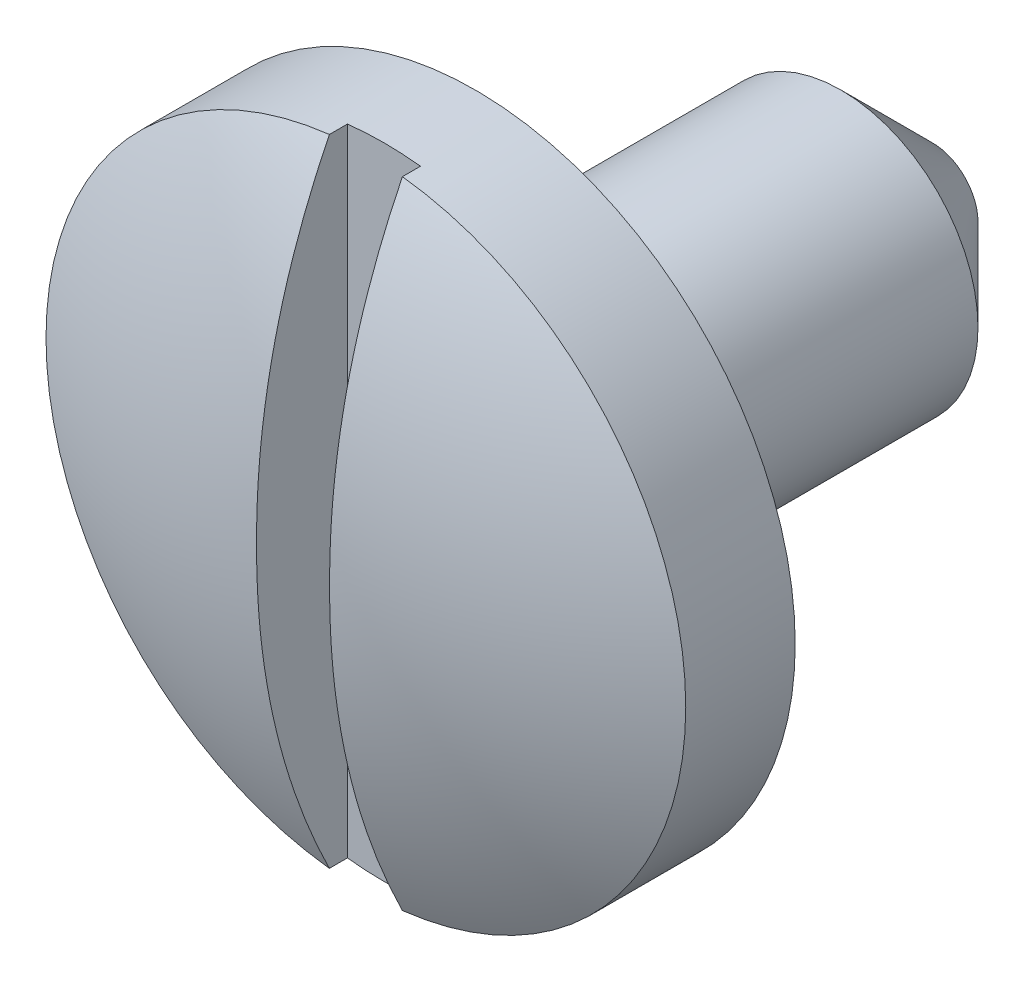
ISO-10303-21;
HEADER;
FILE_DESCRIPTION(('STEP AP214'),'2;1');
FILE_NAME('part.step','',(''),(''),'','','');
FILE_SCHEMA(('AUTOMOTIVE_DESIGN { 1 0 10303 214 1 1 1 1 }'));
ENDSEC;
DATA;
#1=APPLICATION_CONTEXT('core data for automotive mechanical design processes');
#2=APPLICATION_PROTOCOL_DEFINITION('international standard','automotive_design',2000,#1);
#3=PRODUCT_CONTEXT('',#1,'mechanical');
#4=PRODUCT('Part','Part','',(#3));
#5=PRODUCT_RELATED_PRODUCT_CATEGORY('part','',(#4));
#6=PRODUCT_DEFINITION_FORMATION('','',#4);
#7=PRODUCT_DEFINITION_CONTEXT('part definition',#1,'design');
#8=PRODUCT_DEFINITION('design','',#6,#7);
#9=PRODUCT_DEFINITION_SHAPE('','',#8);
#10=(LENGTH_UNIT() NAMED_UNIT(*) SI_UNIT(.MILLI.,.METRE.));
#11=(NAMED_UNIT(*) PLANE_ANGLE_UNIT() SI_UNIT($,.RADIAN.));
#12=(NAMED_UNIT(*) SI_UNIT($,.STERADIAN.) SOLID_ANGLE_UNIT());
#13=UNCERTAINTY_MEASURE_WITH_UNIT(LENGTH_MEASURE(1.E-05),#10,'distance_accuracy_value','');
#14=(GEOMETRIC_REPRESENTATION_CONTEXT(3) GLOBAL_UNCERTAINTY_ASSIGNED_CONTEXT((#13)) GLOBAL_UNIT_ASSIGNED_CONTEXT((#10,
#11,#12)) REPRESENTATION_CONTEXT('',''));
#15=CARTESIAN_POINT('',(0.,0.,0.));
#16=DIRECTION('',(0.,0.,1.));
#17=DIRECTION('',(1.,0.,0.));
#18=AXIS2_PLACEMENT_3D('',#15,#16,#17);
#19=CARTESIAN_POINT('',(0.,0.,2.));
#20=DIRECTION('',(0.,0.,-1.));
#21=DIRECTION('',(-1.,0.,0.));
#22=AXIS2_PLACEMENT_3D('',#19,#20,#21);
#23=CYLINDRICAL_SURFACE('',#22,3.5);
#24=DIRECTION('',(0.,0.,-1.));
#25=VECTOR('',#24,1.);
#26=CARTESIAN_POINT('',(0.399703187916513,3.47710186240918,2.));
#27=LINE('',#26,#25);
#28=CARTESIAN_POINT('',(0.399703187916513,3.47710186240918,1.));
#29=VERTEX_POINT('',#28);
#30=CARTESIAN_POINT('',(0.399703187916513,3.47710186240918,1.1976109992212));
#31=VERTEX_POINT('',#30);
#32=EDGE_CURVE('E112',#29,#31,#27,.F.);
#33=ORIENTED_EDGE('',*,*,#32,.T.);
#34=CARTESIAN_POINT('',(0.,0.,1.19761099922328));
#35=DIRECTION('',(0.,0.,-1.));
#36=DIRECTION('',(-1.,0.,0.));
#37=AXIS2_PLACEMENT_3D('',#34,#35,#36);
#38=CIRCLE('',#37,3.5);
#39=CARTESIAN_POINT('',(0.399703187916513,-3.47710186240918,1.19761099922328));
#40=VERTEX_POINT('',#39);
#41=EDGE_CURVE('E69',#31,#40,#38,.T.);
#42=ORIENTED_EDGE('',*,*,#41,.T.);
#43=DIRECTION('',(0.,0.,-1.));
#44=VECTOR('',#43,1.);
#45=CARTESIAN_POINT('',(0.399703187916513,-3.47710186240918,2.));
#46=LINE('',#45,#44);
#47=CARTESIAN_POINT('',(0.399703187916513,-3.47710186240918,1.));
#48=VERTEX_POINT('',#47);
#49=EDGE_CURVE('E116',#40,#48,#46,.T.);
#50=ORIENTED_EDGE('',*,*,#49,.T.);
#51=CARTESIAN_POINT('',(0.,0.,1.));
#52=DIRECTION('',(0.,0.,-1.));
#53=DIRECTION('',(-1.,0.,0.));
#54=AXIS2_PLACEMENT_3D('',#51,#52,#53);
#55=CIRCLE('',#54,3.5);
#56=CARTESIAN_POINT('',(-0.399703187916513,-3.47710186240918,1.));
#57=VERTEX_POINT('',#56);
#58=EDGE_CURVE('E127',#48,#57,#55,.T.);
#59=ORIENTED_EDGE('',*,*,#58,.T.);
#60=DIRECTION('',(0.,0.,-1.));
#61=VECTOR('',#60,1.);
#62=CARTESIAN_POINT('',(-0.399703187916513,-3.47710186240918,2.));
#63=LINE('',#62,#61);
#64=CARTESIAN_POINT('',(-0.399703187916513,-3.47710186240918,1.1976109992212));
#65=VERTEX_POINT('',#64);
#66=EDGE_CURVE('E103',#57,#65,#63,.F.);
#67=ORIENTED_EDGE('',*,*,#66,.T.);
#68=CARTESIAN_POINT('',(-0.399703187916513,3.47710186240918,1.19761099922328));
#69=VERTEX_POINT('',#68);
#70=EDGE_CURVE('E76',#65,#69,#38,.T.);
#71=ORIENTED_EDGE('',*,*,#70,.T.);
#72=DIRECTION('',(0.,0.,-1.));
#73=VECTOR('',#72,1.);
#74=CARTESIAN_POINT('',(-0.399703187916513,3.47710186240918,2.));
#75=LINE('',#74,#73);
#76=CARTESIAN_POINT('',(-0.399703187916513,3.47710186240918,1.));
#77=VERTEX_POINT('',#76);
#78=EDGE_CURVE('E100',#69,#77,#75,.T.);
#79=ORIENTED_EDGE('',*,*,#78,.T.);
#80=EDGE_CURVE('E130',#77,#29,#55,.T.);
#81=ORIENTED_EDGE('',*,*,#80,.T.);
#82=EDGE_LOOP('',(#33,#42,#50,#59,#67,#71,#79,#81));
#83=FACE_BOUND('',#82,.T.);
#84=CARTESIAN_POINT('',(0.,0.,0.));
#85=DIRECTION('',(0.,0.,1.));
#86=DIRECTION('',(1.,0.,0.));
#87=AXIS2_PLACEMENT_3D('',#84,#85,#86);
#88=CIRCLE('',#87,3.5);
#89=CARTESIAN_POINT('',(3.5,0.,0.));
#90=VERTEX_POINT('',#89);
#91=EDGE_CURVE('E123',#90,#90,#88,.T.);
#92=ORIENTED_EDGE('',*,*,#91,.T.);
#93=EDGE_LOOP('',(#92));
#94=FACE_BOUND('',#93,.T.);
#95=ADVANCED_FACE('F47',(#83,#94),#23,.T.);
#96=CARTESIAN_POINT('',(0.,0.,0.));
#97=DIRECTION('',(0.,0.,1.));
#98=DIRECTION('',(1.,0.,0.));
#99=AXIS2_PLACEMENT_3D('',#96,#97,#98);
#100=PLANE('',#99);
#101=CARTESIAN_POINT('',(0.,0.,0.));
#102=DIRECTION('',(0.,0.,-1.));
#103=DIRECTION('',(-1.,0.,0.));
#104=AXIS2_PLACEMENT_3D('',#101,#102,#103);
#105=CIRCLE('',#104,1.5);
#106=CARTESIAN_POINT('',(-1.5,0.,0.));
#107=VERTEX_POINT('',#106);
#108=EDGE_CURVE('E134',#107,#107,#105,.T.);
#109=ORIENTED_EDGE('',*,*,#108,.F.);
#110=EDGE_LOOP('',(#109));
#111=FACE_BOUND('',#110,.T.);
#112=ORIENTED_EDGE('',*,*,#91,.F.);
#113=EDGE_LOOP('',(#112));
#114=FACE_BOUND('',#113,.T.);
#115=ADVANCED_FACE('F154',(#111,#114),#100,.F.);
#116=CARTESIAN_POINT('',(0.,0.,1.));
#117=DIRECTION('',(0.,0.,-1.));
#118=DIRECTION('',(-1.,0.,0.));
#119=AXIS2_PLACEMENT_3D('',#116,#117,#118);
#120=PLANE('',#119);
#121=DIRECTION('',(0.,-1.,0.));
#122=VECTOR('',#121,1.);
#123=CARTESIAN_POINT('',(-0.399703187916513,-3.72746461289586,1.));
#124=LINE('',#123,#122);
#125=EDGE_CURVE('E110',#77,#57,#124,.T.);
#126=ORIENTED_EDGE('',*,*,#125,.T.);
#127=ORIENTED_EDGE('',*,*,#58,.F.);
#128=DIRECTION('',(0.,1.,0.));
#129=VECTOR('',#128,1.);
#130=CARTESIAN_POINT('',(0.399703187916513,-3.72746461289586,1.));
#131=LINE('',#130,#129);
#132=EDGE_CURVE('E186',#48,#29,#131,.T.);
#133=ORIENTED_EDGE('',*,*,#132,.T.);
#134=ORIENTED_EDGE('',*,*,#80,.F.);
#135=EDGE_LOOP('',(#126,#127,#133,#134));
#136=FACE_BOUND('',#135,.T.);
#137=ADVANCED_FACE('F159',(#136),#120,.F.);
#138=CARTESIAN_POINT('',(0.399703187916513,-3.72746461289586,1.));
#139=DIRECTION('',(1.,0.,0.));
#140=DIRECTION('',(0.,0.,-1.));
#141=AXIS2_PLACEMENT_3D('',#138,#139,#140);
#142=PLANE('',#141);
#143=ORIENTED_EDGE('',*,*,#49,.F.);
#144=CARTESIAN_POINT('',(0.399703187916513,-7.69166794289517,-5.8049218679224));
#145=CARTESIAN_POINT('',(0.399703187916513,-7.69732243156421,-5.59140992214762));
#146=CARTESIAN_POINT('',(0.399703187916513,-7.69392461746745,-5.37766252840087));
#147=CARTESIAN_POINT('',(0.399703187916513,-7.66915006720559,-4.95122195473999));
#148=CARTESIAN_POINT('',(0.399703187916513,-7.64777419018721,-4.7385287249374));
#149=CARTESIAN_POINT('',(0.399703187916513,-7.58718810905384,-4.3158292330126));
#150=CARTESIAN_POINT('',(0.399703187916513,-7.54798873918903,-4.10582141814009));
#151=CARTESIAN_POINT('',(0.399703187916513,-7.45204530207291,-3.6898553564259));
#152=CARTESIAN_POINT('',(0.399703187916513,-7.39530144629259,-3.48389706080549));
#153=CARTESIAN_POINT('',(0.399703187916513,-7.26465057651779,-3.07742998578522));
#154=CARTESIAN_POINT('',(0.399703187916513,-7.19073842943546,-2.8769228562781));
#155=CARTESIAN_POINT('',(0.399703187916513,-7.02625595671172,-2.48277497853286));
#156=CARTESIAN_POINT('',(0.399703187916513,-6.9356795060318,-2.28913678632037));
#157=CARTESIAN_POINT('',(0.399703187916513,-6.73858146806447,-1.91027942304225));
#158=CARTESIAN_POINT('',(0.399703187916513,-6.63206808574615,-1.72505598332377));
#159=CARTESIAN_POINT('',(0.399703187916513,-6.40381666733763,-1.36423467211425));
#160=CARTESIAN_POINT('',(0.399703187916513,-6.28207830998914,-1.18863700384663));
#161=CARTESIAN_POINT('',(0.399703187916513,-6.02425919329414,-0.848339316595567));
#162=CARTESIAN_POINT('',(0.399703187916513,-5.88818011711124,-0.683638022395111));
#163=CARTESIAN_POINT('',(0.399703187916513,-5.60263488857233,-0.366280601681763));
#164=CARTESIAN_POINT('',(0.399703187916513,-5.45316873530768,-0.213624475986437));
#165=CARTESIAN_POINT('',(0.399703187916513,-5.14182381070871,0.0786406681568944));
#166=CARTESIAN_POINT('',(0.399703187916513,-4.97993809466255,0.218242288611019));
#167=CARTESIAN_POINT('',(0.399703187916513,-4.64498321452938,0.483305997908491));
#168=CARTESIAN_POINT('',(0.399703187916513,-4.47191428448923,0.608768382512845));
#169=CARTESIAN_POINT('',(0.399703187916513,-4.11569266662288,0.844750951467281));
#170=CARTESIAN_POINT('',(0.399703187916513,-3.9325327768503,0.955260264166735));
#171=CARTESIAN_POINT('',(0.399703187916513,-3.55761755022345,1.16040611082065));
#172=CARTESIAN_POINT('',(0.399703187916513,-3.36586543884258,1.25504853889531));
#173=CARTESIAN_POINT('',(0.399703187916513,-2.97532038747043,1.42772988811827));
#174=CARTESIAN_POINT('',(0.399703187916513,-2.7765366874103,1.50578971872939));
#175=CARTESIAN_POINT('',(0.399703187916513,-2.37311295824875,1.64490708232764));
#176=CARTESIAN_POINT('',(0.399703187916513,-2.16847345719112,1.70596614305564));
#177=CARTESIAN_POINT('',(0.399703187916513,-1.80156749901062,1.79883597165095));
#178=CARTESIAN_POINT('',(0.399703187916513,-1.64017448670722,1.83413812150275));
#179=CARTESIAN_POINT('',(0.399703187916513,-1.31548908280992,1.89418516551957));
#180=CARTESIAN_POINT('',(0.399703187916513,-1.15219738537519,1.91893380065558));
#181=CARTESIAN_POINT('',(0.399703187916513,-0.824176433322502,1.9578686985888));
#182=CARTESIAN_POINT('',(0.399703187916513,-0.659445775740003,1.97204312292948));
#183=CARTESIAN_POINT('',(0.399703187916513,-0.329360828687565,1.99016419962099));
#184=CARTESIAN_POINT('',(0.399703187916513,-0.164006243658363,1.99410516689867));
#185=CARTESIAN_POINT('',(0.399703187916513,0.113743379071412,1.99408290450603));
#186=CARTESIAN_POINT('',(0.399703187916513,0.226148824802947,1.99224590424486));
#187=CARTESIAN_POINT('',(0.399703187916513,0.450804025861453,1.98412185463607));
#188=CARTESIAN_POINT('',(0.399703187916513,0.563053794021845,1.97783519700958));
#189=CARTESIAN_POINT('',(0.399703187916513,0.787144068967183,1.96041810584968));
#190=CARTESIAN_POINT('',(0.399703187916513,0.898984694699343,1.94928921547179));
#191=CARTESIAN_POINT('',(0.399703187916513,1.12207046040122,1.92214264091602));
#192=CARTESIAN_POINT('',(0.399703187916513,1.23331556272111,1.90612465127138));
#193=CARTESIAN_POINT('',(0.399703187916513,1.5656647639017,1.85074878621709));
#194=CARTESIAN_POINT('',(0.399703187916513,1.78559480506115,1.80405266919004));
#195=CARTESIAN_POINT('',(0.399703187916513,2.22049551964368,1.69137757920551));
#196=CARTESIAN_POINT('',(0.399703187916513,2.43546470066011,1.62539288307655));
#197=CARTESIAN_POINT('',(0.399703187916513,2.8562852387393,1.47551259332148));
#198=CARTESIAN_POINT('',(0.399703187916513,3.06221306778036,1.39183191891616));
#199=CARTESIAN_POINT('',(0.399703187916513,3.46592372282621,1.20676913801401));
#200=CARTESIAN_POINT('',(0.399703187916513,3.66370752075919,1.10538915140658));
#201=CARTESIAN_POINT('',(0.399703187916513,4.04974900729258,0.885633505736068));
#202=CARTESIAN_POINT('',(0.399703187916513,4.23800107841922,0.767247978660769));
#203=CARTESIAN_POINT('',(0.399703187916513,4.60347610723295,0.514385291382944));
#204=CARTESIAN_POINT('',(0.399703187916513,4.7806949089499,0.379902122664026));
#205=CARTESIAN_POINT('',(0.399703187916513,5.11598202440127,0.101462795232559));
#206=CARTESIAN_POINT('',(0.399703187916513,5.27452773516141,-0.0419190763021709));
#207=CARTESIAN_POINT('',(0.399703187916513,5.57904231098603,-0.341599607902217));
#208=CARTESIAN_POINT('',(0.399703187916513,5.72500562970487,-0.497903905328193));
#209=CARTESIAN_POINT('',(0.399703187916513,6.00317856863661,-0.822194207920441));
#210=CARTESIAN_POINT('',(0.399703187916513,6.13539379321662,-0.990175406071446));
#211=CARTESIAN_POINT('',(0.399703187916513,6.38514252833917,-1.33660381436386));
#212=CARTESIAN_POINT('',(0.399703187916513,6.50268260831277,-1.51504628848735));
#213=CARTESIAN_POINT('',(0.399703187916513,6.72237034257954,-1.88129104952427));
#214=CARTESIAN_POINT('',(0.399703187916513,6.82451017404375,-2.06909802928123));
#215=CARTESIAN_POINT('',(0.399703187916513,7.01256422791986,-2.45257801098445));
#216=CARTESIAN_POINT('',(0.399703187916513,7.0984844525321,-2.6482480704927));
#217=CARTESIAN_POINT('',(0.399703187916513,7.25353502538275,-3.04613745039362));
#218=CARTESIAN_POINT('',(0.399703187916513,7.32266557561569,-3.24835669196069));
#219=CARTESIAN_POINT('',(0.399703187916513,7.44363060771922,-3.65782077496074));
#220=CARTESIAN_POINT('',(0.399703187916513,7.49546894961036,-3.865064483722));
#221=CARTESIAN_POINT('',(0.399703187916513,7.59701007906676,-4.35864301345555));
#222=CARTESIAN_POINT('',(0.399703187916513,7.63921584710271,-4.64657412322722));
#223=CARTESIAN_POINT('',(0.399703187916513,7.67757296090128,-5.08028492492817));
#224=CARTESIAN_POINT('',(0.399703187916513,7.68620210965748,-5.22507997629724));
#225=CARTESIAN_POINT('',(0.399703187916513,7.69516021196889,-5.51491420810779));
#226=CARTESIAN_POINT('',(0.399703187916513,7.69548987959288,-5.65995336647302));
#227=CARTESIAN_POINT('',(0.399703187916513,7.69166794289517,-5.8049218679224));
#228=B_SPLINE_CURVE_WITH_KNOTS('',3,(#144,#145,#146,#147,#148,#149,#150,#151,#152,#153,#154,
#155,#156,#157,#158,#159,#160,#161,#162,#163,#164,#165,#166,#167,#168,#169,#170,#171,#172,#173,
#174,#175,#176,#177,#178,#179,#180,#181,#182,#183,#184,#185,#186,#187,#188,#189,#190,#191,#192,
#193,#194,#195,#196,#197,#198,#199,#200,#201,#202,#203,#204,#205,#206,#207,#208,#209,#210,#211,
#212,#213,#214,#215,#216,#217,#218,#219,#220,#221,#222,#223,#224,#225,#226,#227),.UNSPECIFIED.,
.F.,.F.,(4,2,2,2,2,2,2,2,2,2,2,2,2,2,2,2,2,2,2,2,2,2,2,2,2,2,2,2,2,2,2,2,2,2,2,2,2,2,2,2,2,4),
(0.,0.640564838885299,1.28109906780358,1.92124445881535,2.56138213418883,3.20171144902427,
3.84227659163729,4.48251307332425,5.12276306675648,5.76293799785524,6.4031129724059,
7.04364856330828,7.68417075315915,8.32515616155473,8.96590293099868,9.6058369052292,
10.2457133544735,10.7410085542547,11.2361280373786,11.7318010076761,12.2277492842359,
12.564953431696,12.9021278974171,13.2391949887074,13.5762831439747,14.2498236422092,
14.923564191846,15.5895491856644,16.2554544675054,16.9217477351227,17.588290479747,
18.2288283196413,18.869647081383,19.5102035827472,20.1504722984686,20.7910651621659,
21.4314205024391,22.071768138293,22.7119727379535,23.5828127119514,24.0177697950823,
24.4526894553517),.UNSPECIFIED.);
#229=EDGE_CURVE('E105',#40,#31,#228,.T.);
#230=ORIENTED_EDGE('',*,*,#229,.T.);
#231=ORIENTED_EDGE('',*,*,#32,.F.);
#232=ORIENTED_EDGE('',*,*,#132,.F.);
#233=EDGE_LOOP('',(#143,#230,#231,#232));
#234=FACE_BOUND('',#233,.T.);
#235=ADVANCED_FACE('F163',(#234),#142,.F.);
#236=CARTESIAN_POINT('',(-0.399703187916513,-3.72746461289586,1.));
#237=DIRECTION('',(-1.,0.,0.));
#238=DIRECTION('',(0.,0.,1.));
#239=AXIS2_PLACEMENT_3D('',#236,#237,#238);
#240=PLANE('',#239);
#241=ORIENTED_EDGE('',*,*,#78,.F.);
#242=CARTESIAN_POINT('',(-0.399703187916513,7.69166794289517,-5.8049218679224));
#243=CARTESIAN_POINT('',(-0.399703187916513,7.69732243156421,-5.59140992214762));
#244=CARTESIAN_POINT('',(-0.399703187916513,7.69392461746745,-5.37766252840087));
#245=CARTESIAN_POINT('',(-0.399703187916513,7.66915006720559,-4.95122195473999));
#246=CARTESIAN_POINT('',(-0.399703187916513,7.64777419018721,-4.7385287249374));
#247=CARTESIAN_POINT('',(-0.399703187916513,7.58718810905384,-4.3158292330126));
#248=CARTESIAN_POINT('',(-0.399703187916513,7.54798873918903,-4.10582141814009));
#249=CARTESIAN_POINT('',(-0.399703187916513,7.45204530207291,-3.6898553564259));
#250=CARTESIAN_POINT('',(-0.399703187916513,7.39530144629259,-3.48389706080549));
#251=CARTESIAN_POINT('',(-0.399703187916513,7.26465057651779,-3.07742998578522));
#252=CARTESIAN_POINT('',(-0.399703187916513,7.19073842943546,-2.8769228562781));
#253=CARTESIAN_POINT('',(-0.399703187916513,7.02625595671172,-2.48277497853286));
#254=CARTESIAN_POINT('',(-0.399703187916513,6.9356795060318,-2.28913678632037));
#255=CARTESIAN_POINT('',(-0.399703187916513,6.73858146806447,-1.91027942304225));
#256=CARTESIAN_POINT('',(-0.399703187916513,6.63206808574615,-1.72505598332377));
#257=CARTESIAN_POINT('',(-0.399703187916513,6.40381666733763,-1.36423467211425));
#258=CARTESIAN_POINT('',(-0.399703187916513,6.28207830998914,-1.18863700384663));
#259=CARTESIAN_POINT('',(-0.399703187916513,6.02425919329414,-0.848339316595567));
#260=CARTESIAN_POINT('',(-0.399703187916513,5.88818011711124,-0.683638022395111));
#261=CARTESIAN_POINT('',(-0.399703187916513,5.60263488857233,-0.366280601681763));
#262=CARTESIAN_POINT('',(-0.399703187916513,5.45316873530768,-0.213624475986437));
#263=CARTESIAN_POINT('',(-0.399703187916513,5.14182381070871,0.0786406681568944));
#264=CARTESIAN_POINT('',(-0.399703187916513,4.97993809466255,0.218242288611019));
#265=CARTESIAN_POINT('',(-0.399703187916513,4.64498321452938,0.483305997908491));
#266=CARTESIAN_POINT('',(-0.399703187916513,4.47191428448923,0.608768382512845));
#267=CARTESIAN_POINT('',(-0.399703187916513,4.11569266662288,0.844750951467281));
#268=CARTESIAN_POINT('',(-0.399703187916513,3.9325327768503,0.955260264166735));
#269=CARTESIAN_POINT('',(-0.399703187916513,3.55761755022345,1.16040611082065));
#270=CARTESIAN_POINT('',(-0.399703187916513,3.36586543884258,1.25504853889531));
#271=CARTESIAN_POINT('',(-0.399703187916513,2.97532038747043,1.42772988811827));
#272=CARTESIAN_POINT('',(-0.399703187916513,2.7765366874103,1.50578971872939));
#273=CARTESIAN_POINT('',(-0.399703187916513,2.37311295824875,1.64490708232764));
#274=CARTESIAN_POINT('',(-0.399703187916513,2.16847345719112,1.70596614305564));
#275=CARTESIAN_POINT('',(-0.399703187916513,1.80156749901062,1.79883597165095));
#276=CARTESIAN_POINT('',(-0.399703187916513,1.64017448670722,1.83413812150275));
#277=CARTESIAN_POINT('',(-0.399703187916513,1.31548908280992,1.89418516551957));
#278=CARTESIAN_POINT('',(-0.399703187916513,1.15219738537519,1.91893380065558));
#279=CARTESIAN_POINT('',(-0.399703187916513,0.824176433322502,1.9578686985888));
#280=CARTESIAN_POINT('',(-0.399703187916513,0.659445775740003,1.97204312292948));
#281=CARTESIAN_POINT('',(-0.399703187916513,0.329360828687565,1.99016419962099));
#282=CARTESIAN_POINT('',(-0.399703187916513,0.164006243658363,1.99410516689867));
#283=CARTESIAN_POINT('',(-0.399703187916513,-0.113743379071412,1.99408290450603));
#284=CARTESIAN_POINT('',(-0.399703187916513,-0.226148824802947,1.99224590424486));
#285=CARTESIAN_POINT('',(-0.399703187916513,-0.450804025861453,1.98412185463607));
#286=CARTESIAN_POINT('',(-0.399703187916513,-0.563053794021845,1.97783519700958));
#287=CARTESIAN_POINT('',(-0.399703187916513,-0.787144068967183,1.96041810584968));
#288=CARTESIAN_POINT('',(-0.399703187916513,-0.898984694699343,1.94928921547179));
#289=CARTESIAN_POINT('',(-0.399703187916513,-1.12207046040122,1.92214264091602));
#290=CARTESIAN_POINT('',(-0.399703187916513,-1.23331556272111,1.90612465127138));
#291=CARTESIAN_POINT('',(-0.399703187916513,-1.5656647639017,1.85074878621709));
#292=CARTESIAN_POINT('',(-0.399703187916513,-1.78559480506115,1.80405266919004));
#293=CARTESIAN_POINT('',(-0.399703187916513,-2.22049551964368,1.69137757920551));
#294=CARTESIAN_POINT('',(-0.399703187916513,-2.43546470066011,1.62539288307655));
#295=CARTESIAN_POINT('',(-0.399703187916513,-2.8562852387393,1.47551259332148));
#296=CARTESIAN_POINT('',(-0.399703187916513,-3.06221306778036,1.39183191891616));
#297=CARTESIAN_POINT('',(-0.399703187916513,-3.46592372282621,1.20676913801401));
#298=CARTESIAN_POINT('',(-0.399703187916513,-3.66370752075919,1.10538915140658));
#299=CARTESIAN_POINT('',(-0.399703187916513,-4.04974900729258,0.885633505736068));
#300=CARTESIAN_POINT('',(-0.399703187916513,-4.23800107841922,0.767247978660769));
#301=CARTESIAN_POINT('',(-0.399703187916513,-4.60347610723295,0.514385291382944));
#302=CARTESIAN_POINT('',(-0.399703187916513,-4.7806949089499,0.379902122664026));
#303=CARTESIAN_POINT('',(-0.399703187916513,-5.11598202440127,0.101462795232559));
#304=CARTESIAN_POINT('',(-0.399703187916513,-5.27452773516141,-0.0419190763021709));
#305=CARTESIAN_POINT('',(-0.399703187916513,-5.57904231098603,-0.341599607902217));
#306=CARTESIAN_POINT('',(-0.399703187916513,-5.72500562970487,-0.497903905328193));
#307=CARTESIAN_POINT('',(-0.399703187916513,-6.00317856863661,-0.822194207920441));
#308=CARTESIAN_POINT('',(-0.399703187916513,-6.13539379321662,-0.990175406071446));
#309=CARTESIAN_POINT('',(-0.399703187916513,-6.38514252833917,-1.33660381436386));
#310=CARTESIAN_POINT('',(-0.399703187916513,-6.50268260831277,-1.51504628848735));
#311=CARTESIAN_POINT('',(-0.399703187916513,-6.72237034257954,-1.88129104952427));
#312=CARTESIAN_POINT('',(-0.399703187916513,-6.82451017404375,-2.06909802928123));
#313=CARTESIAN_POINT('',(-0.399703187916513,-7.01256422791986,-2.45257801098445));
#314=CARTESIAN_POINT('',(-0.399703187916513,-7.0984844525321,-2.6482480704927));
#315=CARTESIAN_POINT('',(-0.399703187916513,-7.25353502538275,-3.04613745039362));
#316=CARTESIAN_POINT('',(-0.399703187916513,-7.32266557561569,-3.24835669196069));
#317=CARTESIAN_POINT('',(-0.399703187916513,-7.44363060771922,-3.65782077496074));
#318=CARTESIAN_POINT('',(-0.399703187916513,-7.49546894961036,-3.865064483722));
#319=CARTESIAN_POINT('',(-0.399703187916513,-7.59701007906676,-4.35864301345555));
#320=CARTESIAN_POINT('',(-0.399703187916513,-7.63921584710271,-4.64657412322722));
#321=CARTESIAN_POINT('',(-0.399703187916513,-7.67757296090128,-5.08028492492817));
#322=CARTESIAN_POINT('',(-0.399703187916513,-7.68620210965748,-5.22507997629724));
#323=CARTESIAN_POINT('',(-0.399703187916513,-7.69516021196889,-5.51491420810779));
#324=CARTESIAN_POINT('',(-0.399703187916513,-7.69548987959288,-5.65995336647302));
#325=CARTESIAN_POINT('',(-0.399703187916513,-7.69166794289517,-5.8049218679224));
#326=B_SPLINE_CURVE_WITH_KNOTS('',3,(#242,#243,#244,#245,#246,#247,#248,#249,#250,#251,#252,
#253,#254,#255,#256,#257,#258,#259,#260,#261,#262,#263,#264,#265,#266,#267,#268,#269,#270,#271,
#272,#273,#274,#275,#276,#277,#278,#279,#280,#281,#282,#283,#284,#285,#286,#287,#288,#289,#290,
#291,#292,#293,#294,#295,#296,#297,#298,#299,#300,#301,#302,#303,#304,#305,#306,#307,#308,#309,
#310,#311,#312,#313,#314,#315,#316,#317,#318,#319,#320,#321,#322,#323,#324,#325),.UNSPECIFIED.,
.F.,.F.,(4,2,2,2,2,2,2,2,2,2,2,2,2,2,2,2,2,2,2,2,2,2,2,2,2,2,2,2,2,2,2,2,2,2,2,2,2,2,2,2,2,4),
(0.,0.640564838885299,1.28109906780358,1.92124445881535,2.56138213418883,3.20171144902427,
3.84227659163729,4.48251307332425,5.12276306675648,5.76293799785524,6.4031129724059,
7.04364856330828,7.68417075315915,8.32515616155473,8.96590293099868,9.6058369052292,
10.2457133544735,10.7410085542547,11.2361280373786,11.7318010076761,12.2277492842359,
12.564953431696,12.9021278974171,13.2391949887074,13.5762831439747,14.2498236422092,
14.923564191846,15.5895491856644,16.2554544675054,16.9217477351227,17.588290479747,
18.2288283196413,18.869647081383,19.5102035827472,20.1504722984686,20.7910651621659,
21.4314205024391,22.071768138293,22.7119727379535,23.5828127119514,24.0177697950823,
24.4526894553517),.UNSPECIFIED.);
#327=EDGE_CURVE('E11',#69,#65,#326,.T.);
#328=ORIENTED_EDGE('',*,*,#327,.T.);
#329=ORIENTED_EDGE('',*,*,#66,.F.);
#330=ORIENTED_EDGE('',*,*,#125,.F.);
#331=EDGE_LOOP('',(#241,#328,#329,#330));
#332=FACE_BOUND('',#331,.T.);
#333=ADVANCED_FACE('F108',(#332),#240,.F.);
#334=CARTESIAN_POINT('',(0.,0.,-5.));
#335=DIRECTION('',(0.,0.,1.));
#336=DIRECTION('',(1.,0.,0.));
#337=AXIS2_PLACEMENT_3D('',#334,#335,#336);
#338=CYLINDRICAL_SURFACE('',#337,1.5);
#339=CARTESIAN_POINT('',(0.,0.,-4.));
#340=DIRECTION('',(0.,0.,-1.));
#341=DIRECTION('',(-1.,0.,0.));
#342=AXIS2_PLACEMENT_3D('',#339,#340,#341);
#343=CIRCLE('',#342,1.5);
#344=CARTESIAN_POINT('',(1.5,0.,-4.));
#345=VERTEX_POINT('',#344);
#346=EDGE_CURVE('E63',#345,#345,#343,.F.);
#347=ORIENTED_EDGE('',*,*,#346,.T.);
#348=EDGE_LOOP('',(#347));
#349=FACE_BOUND('',#348,.T.);
#350=ORIENTED_EDGE('',*,*,#108,.T.);
#351=EDGE_LOOP('',(#350));
#352=FACE_BOUND('',#351,.T.);
#353=ADVANCED_FACE('F139',(#349,#352),#338,.T.);
#354=CARTESIAN_POINT('',(0.,0.,-5.));
#355=DIRECTION('',(0.,0.,-1.));
#356=DIRECTION('',(-1.,0.,0.));
#357=AXIS2_PLACEMENT_3D('',#354,#355,#356);
#358=PLANE('',#357);
#359=CARTESIAN_POINT('',(0.,0.,-5.));
#360=DIRECTION('',(0.,0.,-1.));
#361=DIRECTION('',(-1.,0.,0.));
#362=AXIS2_PLACEMENT_3D('',#359,#360,#361);
#363=CIRCLE('',#362,0.5);
#364=CARTESIAN_POINT('',(0.500000000000001,0.,-5.));
#365=VERTEX_POINT('',#364);
#366=EDGE_CURVE('E131',#365,#365,#363,.T.);
#367=ORIENTED_EDGE('',*,*,#366,.T.);
#368=EDGE_LOOP('',(#367));
#369=FACE_BOUND('',#368,.T.);
#370=ADVANCED_FACE('F144',(#369),#358,.T.);
#371=CARTESIAN_POINT('',(0.,0.,-5.));
#372=DIRECTION('',(0.,0.,1.));
#373=DIRECTION('',(1.,0.,0.));
#374=AXIS2_PLACEMENT_3D('',#371,#372,#373);
#375=CONICAL_SURFACE('',#374,0.5,0.785398163397447);
#376=CARTESIAN_POINT('',(1.5,0.,-4.));
#377=CARTESIAN_POINT('',(1.48958333333333,0.,-4.01041666666666));
#378=CARTESIAN_POINT('',(1.47916666666667,0.,-4.02083333333333));
#379=CARTESIAN_POINT('',(1.45833333333333,0.,-4.04166666666666));
#380=CARTESIAN_POINT('',(1.44791666666667,0.,-4.05208333333333));
#381=CARTESIAN_POINT('',(1.42708333333333,0.,-4.07291666666666));
#382=CARTESIAN_POINT('',(1.41666666666667,0.,-4.08333333333333));
#383=CARTESIAN_POINT('',(1.39583333333333,0.,-4.10416666666666));
#384=CARTESIAN_POINT('',(1.38541666666667,0.,-4.11458333333333));
#385=CARTESIAN_POINT('',(1.36458333333333,0.,-4.13541666666666));
#386=CARTESIAN_POINT('',(1.35416666666667,0.,-4.14583333333333));
#387=CARTESIAN_POINT('',(1.33333333333333,0.,-4.16666666666666));
#388=CARTESIAN_POINT('',(1.32291666666667,0.,-4.17708333333333));
#389=CARTESIAN_POINT('',(1.30208333333333,0.,-4.19791666666666));
#390=CARTESIAN_POINT('',(1.29166666666667,0.,-4.20833333333333));
#391=CARTESIAN_POINT('',(1.27083333333333,0.,-4.22916666666666));
#392=CARTESIAN_POINT('',(1.26041666666667,0.,-4.23958333333333));
#393=CARTESIAN_POINT('',(1.23958333333333,0.,-4.26041666666666));
#394=CARTESIAN_POINT('',(1.22916666666667,0.,-4.27083333333333));
#395=CARTESIAN_POINT('',(1.20833333333333,0.,-4.29166666666666));
#396=CARTESIAN_POINT('',(1.19791666666667,0.,-4.30208333333333));
#397=CARTESIAN_POINT('',(1.17708333333333,0.,-4.32291666666666));
#398=CARTESIAN_POINT('',(1.16666666666667,0.,-4.33333333333333));
#399=CARTESIAN_POINT('',(1.14583333333333,0.,-4.35416666666666));
#400=CARTESIAN_POINT('',(1.13541666666667,0.,-4.36458333333333));
#401=CARTESIAN_POINT('',(1.11458333333333,0.,-4.38541666666666));
#402=CARTESIAN_POINT('',(1.10416666666667,0.,-4.39583333333333));
#403=CARTESIAN_POINT('',(1.08333333333333,0.,-4.41666666666666));
#404=CARTESIAN_POINT('',(1.07291666666667,0.,-4.42708333333333));
#405=CARTESIAN_POINT('',(1.05208333333333,0.,-4.44791666666666));
#406=CARTESIAN_POINT('',(1.04166666666667,0.,-4.45833333333333));
#407=CARTESIAN_POINT('',(1.02083333333333,0.,-4.47916666666666));
#408=CARTESIAN_POINT('',(1.01041666666667,0.,-4.48958333333333));
#409=CARTESIAN_POINT('',(0.989583333333334,0.,-4.51041666666666));
#410=CARTESIAN_POINT('',(0.979166666666668,0.,-4.52083333333333));
#411=CARTESIAN_POINT('',(0.958333333333334,0.,-4.54166666666666));
#412=CARTESIAN_POINT('',(0.947916666666667,0.,-4.55208333333333));
#413=CARTESIAN_POINT('',(0.927083333333334,0.,-4.57291666666666));
#414=CARTESIAN_POINT('',(0.916666666666668,0.,-4.58333333333333));
#415=CARTESIAN_POINT('',(0.895833333333334,0.,-4.60416666666666));
#416=CARTESIAN_POINT('',(0.885416666666667,0.,-4.61458333333333));
#417=CARTESIAN_POINT('',(0.864583333333334,0.,-4.63541666666667));
#418=CARTESIAN_POINT('',(0.854166666666667,0.,-4.64583333333333));
#419=CARTESIAN_POINT('',(0.833333333333334,0.,-4.66666666666667));
#420=CARTESIAN_POINT('',(0.822916666666668,0.,-4.67708333333333));
#421=CARTESIAN_POINT('',(0.802083333333334,0.,-4.69791666666667));
#422=CARTESIAN_POINT('',(0.791666666666668,0.,-4.70833333333333));
#423=CARTESIAN_POINT('',(0.770833333333334,0.,-4.72916666666667));
#424=CARTESIAN_POINT('',(0.760416666666668,0.,-4.73958333333333));
#425=CARTESIAN_POINT('',(0.739583333333334,0.,-4.76041666666667));
#426=CARTESIAN_POINT('',(0.729166666666668,0.,-4.77083333333333));
#427=CARTESIAN_POINT('',(0.708333333333334,0.,-4.79166666666667));
#428=CARTESIAN_POINT('',(0.697916666666668,0.,-4.80208333333333));
#429=CARTESIAN_POINT('',(0.677083333333334,0.,-4.82291666666667));
#430=CARTESIAN_POINT('',(0.666666666666668,0.,-4.83333333333333));
#431=CARTESIAN_POINT('',(0.645833333333334,0.,-4.85416666666667));
#432=CARTESIAN_POINT('',(0.635416666666668,0.,-4.86458333333333));
#433=CARTESIAN_POINT('',(0.614583333333334,0.,-4.88541666666667));
#434=CARTESIAN_POINT('',(0.604166666666668,0.,-4.89583333333333));
#435=CARTESIAN_POINT('',(0.583333333333334,0.,-4.91666666666667));
#436=CARTESIAN_POINT('',(0.572916666666668,0.,-4.92708333333333));
#437=CARTESIAN_POINT('',(0.552083333333334,0.,-4.94791666666667));
#438=CARTESIAN_POINT('',(0.541666666666668,0.,-4.95833333333333));
#439=CARTESIAN_POINT('',(0.520833333333334,0.,-4.97916666666667));
#440=CARTESIAN_POINT('',(0.510416666666668,0.,-4.98958333333333));
#441=CARTESIAN_POINT('',(0.500000000000001,0.,-5.));
#442=B_SPLINE_CURVE_WITH_KNOTS('',3,(#376,#377,#378,#379,#380,#381,#382,#383,#384,#385,#386,
#387,#388,#389,#390,#391,#392,#393,#394,#395,#396,#397,#398,#399,#400,#401,#402,#403,#404,#405,
#406,#407,#408,#409,#410,#411,#412,#413,#414,#415,#416,#417,#418,#419,#420,#421,#422,#423,#424,
#425,#426,#427,#428,#429,#430,#431,#432,#433,#434,#435,#436,#437,#438,#439,#440,#441),
.UNSPECIFIED.,.F.,.F.,(4,2,2,2,2,2,2,2,2,2,2,2,2,2,2,2,2,2,2,2,2,2,2,2,2,2,2,2,2,2,2,2,4),(0.,
0.0441941738241593,0.0883883476483185,0.132582521472478,0.176776695296637,0.220970869120796,
0.265165042944955,0.309359216769115,0.353553390593274,0.397747564417433,0.441941738241593,
0.486135912065752,0.530330085889912,0.574524259714071,0.61871843353823,0.662912607362389,
0.707106781186548,0.751300955010708,0.795495128834867,0.839689302659026,0.883883476483186,
0.928077650307345,0.972271824131504,1.01646599795566,1.06066017177982,1.10485434560398,
1.14904851942814,1.1932426932523,1.23743686707646,1.28163104090062,1.32582521472478,
1.37001938854894,1.4142135623731),.UNSPECIFIED.);
#443=EDGE_CURVE('BSEAM50',#345,#365,#442,.T.);
#444=ORIENTED_EDGE('',*,*,#346,.F.);
#445=ORIENTED_EDGE('',*,*,#366,.F.);
#446=ORIENTED_EDGE('',*,*,#443,.T.);
#447=ORIENTED_EDGE('',*,*,#443,.F.);
#448=EDGE_LOOP('',(#444,#446,#445,#447));
#449=FACE_BOUND('',#448,.T.);
#450=ADVANCED_FACE('F50',(#449),#375,.T.);
#451=CARTESIAN_POINT('',(0.,0.,-5.60468307563663));
#452=DIRECTION('',(0.,0.,1.));
#453=DIRECTION('',(1.,0.,0.));
#454=AXIS2_PLACEMENT_3D('',#451,#452,#453);
#455=DEGENERATE_TOROIDAL_SURFACE('',#454,0.1,7.60468307563663,.T.);
#456=ORIENTED_EDGE('',*,*,#327,.F.);
#457=ORIENTED_EDGE('',*,*,#70,.F.);
#458=EDGE_LOOP('',(#456,#457));
#459=FACE_BOUND('',#458,.T.);
#460=ADVANCED_FACE('F92',(#459),#455,.T.);
#461=ORIENTED_EDGE('',*,*,#229,.F.);
#462=ORIENTED_EDGE('',*,*,#41,.F.);
#463=EDGE_LOOP('',(#461,#462));
#464=FACE_BOUND('',#463,.T.);
#465=ADVANCED_FACE('F176',(#464),#455,.T.);
#466=CLOSED_SHELL('',(#95,#115,#137,#235,#333,#353,#370,#450,#460,#465));
#467=MANIFOLD_SOLID_BREP('B2',#466);
#468=ADVANCED_BREP_SHAPE_REPRESENTATION('',(#18,#467),#14);
#469=SHAPE_DEFINITION_REPRESENTATION(#9,#468);
ENDSEC;
END-ISO-10303-21;
